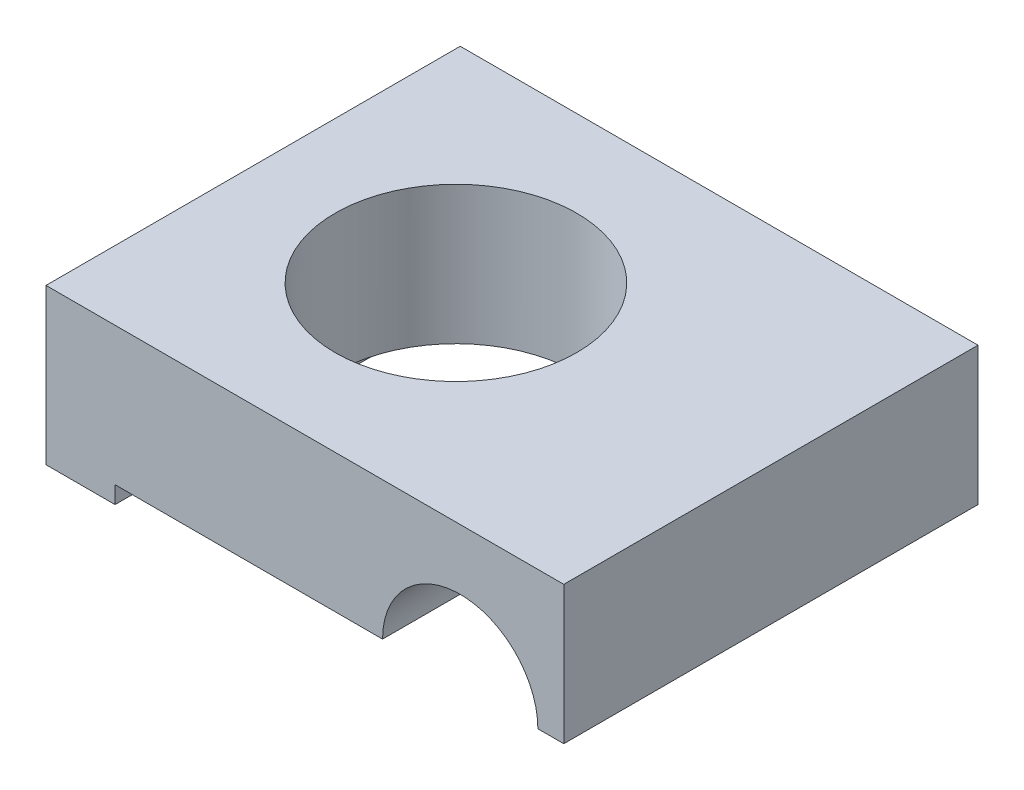
ISO-10303-21;
HEADER;
FILE_DESCRIPTION(('STEP AP214'),'2;1');
FILE_NAME('part.step','',(''),(''),'','','');
FILE_SCHEMA(('AUTOMOTIVE_DESIGN { 1 0 10303 214 1 1 1 1 }'));
ENDSEC;
DATA;
#1=APPLICATION_CONTEXT('core data for automotive mechanical design processes');
#2=APPLICATION_PROTOCOL_DEFINITION('international standard','automotive_design',2000,#1);
#3=PRODUCT_CONTEXT('',#1,'mechanical');
#4=PRODUCT('Part','Part','',(#3));
#5=PRODUCT_RELATED_PRODUCT_CATEGORY('part','',(#4));
#6=PRODUCT_DEFINITION_FORMATION('','',#4);
#7=PRODUCT_DEFINITION_CONTEXT('part definition',#1,'design');
#8=PRODUCT_DEFINITION('design','',#6,#7);
#9=PRODUCT_DEFINITION_SHAPE('','',#8);
#10=(LENGTH_UNIT() NAMED_UNIT(*) SI_UNIT(.MILLI.,.METRE.));
#11=(NAMED_UNIT(*) PLANE_ANGLE_UNIT() SI_UNIT($,.RADIAN.));
#12=(NAMED_UNIT(*) SI_UNIT($,.STERADIAN.) SOLID_ANGLE_UNIT());
#13=UNCERTAINTY_MEASURE_WITH_UNIT(LENGTH_MEASURE(1.E-05),#10,'distance_accuracy_value','');
#14=(GEOMETRIC_REPRESENTATION_CONTEXT(3) GLOBAL_UNCERTAINTY_ASSIGNED_CONTEXT((#13)) GLOBAL_UNIT_ASSIGNED_CONTEXT((#10,
#11,#12)) REPRESENTATION_CONTEXT('',''));
#15=CARTESIAN_POINT('',(0.,0.,0.));
#16=DIRECTION('',(0.,0.,1.));
#17=DIRECTION('',(1.,0.,0.));
#18=AXIS2_PLACEMENT_3D('',#15,#16,#17);
#19=CARTESIAN_POINT('',(0.,0.,6.));
#20=DIRECTION('',(0.,0.,-1.));
#21=DIRECTION('',(-1.,0.,0.));
#22=AXIS2_PLACEMENT_3D('',#19,#20,#21);
#23=CYLINDRICAL_SURFACE('',#22,2.25);
#24=CARTESIAN_POINT('',(0.,0.,-6.));
#25=DIRECTION('',(0.,0.,1.));
#26=DIRECTION('',(1.,0.,0.));
#27=AXIS2_PLACEMENT_3D('',#24,#25,#26);
#28=CIRCLE('',#27,2.25);
#29=CARTESIAN_POINT('',(2.25,0.,-6.));
#30=VERTEX_POINT('',#29);
#31=CARTESIAN_POINT('',(-2.25,0.,-6.));
#32=VERTEX_POINT('',#31);
#33=EDGE_CURVE('E125',#30,#32,#28,.T.);
#34=ORIENTED_EDGE('',*,*,#33,.F.);
#35=DIRECTION('',(0.,0.,-1.));
#36=VECTOR('',#35,1.);
#37=CARTESIAN_POINT('',(2.25,0.,6.));
#38=LINE('',#37,#36);
#39=CARTESIAN_POINT('',(2.25,0.,6.));
#40=VERTEX_POINT('',#39);
#41=EDGE_CURVE('E11',#40,#30,#38,.T.);
#42=ORIENTED_EDGE('',*,*,#41,.F.);
#43=CARTESIAN_POINT('',(0.,0.,6.));
#44=DIRECTION('',(0.,0.,1.));
#45=DIRECTION('',(1.,0.,0.));
#46=AXIS2_PLACEMENT_3D('',#43,#44,#45);
#47=CIRCLE('',#46,2.25);
#48=CARTESIAN_POINT('',(-2.25,0.,6.));
#49=VERTEX_POINT('',#48);
#50=EDGE_CURVE('E146',#40,#49,#47,.T.);
#51=ORIENTED_EDGE('',*,*,#50,.T.);
#52=DIRECTION('',(0.,0.,-1.));
#53=VECTOR('',#52,1.);
#54=CARTESIAN_POINT('',(-2.25,0.,6.));
#55=LINE('',#54,#53);
#56=EDGE_CURVE('E48',#49,#32,#55,.T.);
#57=ORIENTED_EDGE('',*,*,#56,.T.);
#58=EDGE_LOOP('',(#34,#42,#51,#57));
#59=FACE_BOUND('',#58,.T.);
#60=ADVANCED_FACE('F32',(#59),#23,.F.);
#61=CARTESIAN_POINT('',(-4.51084990785713,0.,6.));
#62=DIRECTION('',(0.,-1.,0.));
#63=DIRECTION('',(1.,0.,0.));
#64=AXIS2_PLACEMENT_3D('',#61,#62,#63);
#65=PLANE('',#64);
#66=DIRECTION('',(-1.,0.,0.));
#67=VECTOR('',#66,1.);
#68=CARTESIAN_POINT('',(-4.51084990785713,0.,-6.));
#69=LINE('',#68,#67);
#70=CARTESIAN_POINT('',(3.,0.,-6.));
#71=VERTEX_POINT('',#70);
#72=EDGE_CURVE('E127',#71,#30,#69,.T.);
#73=ORIENTED_EDGE('',*,*,#72,.F.);
#74=DIRECTION('',(0.,0.,-1.));
#75=VECTOR('',#74,1.);
#76=CARTESIAN_POINT('',(3.,0.,6.));
#77=LINE('',#76,#75);
#78=CARTESIAN_POINT('',(3.,0.,6.));
#79=VERTEX_POINT('',#78);
#80=EDGE_CURVE('E40',#79,#71,#77,.T.);
#81=ORIENTED_EDGE('',*,*,#80,.F.);
#82=DIRECTION('',(-1.,0.,0.));
#83=VECTOR('',#82,1.);
#84=CARTESIAN_POINT('',(-4.51084990785713,0.,6.));
#85=LINE('',#84,#83);
#86=EDGE_CURVE('E172',#79,#40,#85,.T.);
#87=ORIENTED_EDGE('',*,*,#86,.T.);
#88=ORIENTED_EDGE('',*,*,#41,.T.);
#89=EDGE_LOOP('',(#73,#81,#87,#88));
#90=FACE_BOUND('',#89,.T.);
#91=ADVANCED_FACE('F163',(#90),#65,.T.);
#92=CARTESIAN_POINT('',(3.,-10.8077815239313,6.));
#93=DIRECTION('',(1.,0.,0.));
#94=DIRECTION('',(0.,1.,0.));
#95=AXIS2_PLACEMENT_3D('',#92,#93,#94);
#96=PLANE('',#95);
#97=DIRECTION('',(0.,-1.,0.));
#98=VECTOR('',#97,1.);
#99=CARTESIAN_POINT('',(3.,-10.8077815239313,-6.));
#100=LINE('',#99,#98);
#101=CARTESIAN_POINT('',(3.,4.,-6.));
#102=VERTEX_POINT('',#101);
#103=EDGE_CURVE('E131',#102,#71,#100,.T.);
#104=ORIENTED_EDGE('',*,*,#103,.F.);
#105=DIRECTION('',(0.,0.,-1.));
#106=VECTOR('',#105,1.);
#107=CARTESIAN_POINT('',(3.,4.,6.));
#108=LINE('',#107,#106);
#109=CARTESIAN_POINT('',(3.,4.,6.));
#110=VERTEX_POINT('',#109);
#111=EDGE_CURVE('E152',#110,#102,#108,.T.);
#112=ORIENTED_EDGE('',*,*,#111,.F.);
#113=DIRECTION('',(0.,-1.,0.));
#114=VECTOR('',#113,1.);
#115=CARTESIAN_POINT('',(3.,-10.8077815239313,6.));
#116=LINE('',#115,#114);
#117=EDGE_CURVE('E159',#110,#79,#116,.T.);
#118=ORIENTED_EDGE('',*,*,#117,.T.);
#119=ORIENTED_EDGE('',*,*,#80,.T.);
#120=EDGE_LOOP('',(#104,#112,#118,#119));
#121=FACE_BOUND('',#120,.T.);
#122=ADVANCED_FACE('F157',(#121),#96,.T.);
#123=CARTESIAN_POINT('',(-4.51084990785713,4.,6.));
#124=DIRECTION('',(0.,1.,0.));
#125=DIRECTION('',(0.,0.,1.));
#126=AXIS2_PLACEMENT_3D('',#123,#124,#125);
#127=PLANE('',#126);
#128=CARTESIAN_POINT('',(-6.125,4.,0.));
#129=DIRECTION('',(0.,1.,0.));
#130=DIRECTION('',(0.,0.,1.));
#131=AXIS2_PLACEMENT_3D('',#128,#129,#130);
#132=CIRCLE('',#131,3.5);
#133=CARTESIAN_POINT('',(-6.125,4.,3.5));
#134=VERTEX_POINT('',#133);
#135=EDGE_CURVE('E128',#134,#134,#132,.T.);
#136=ORIENTED_EDGE('',*,*,#135,.F.);
#137=EDGE_LOOP('',(#136));
#138=FACE_BOUND('',#137,.T.);
#139=DIRECTION('',(1.,0.,0.));
#140=VECTOR('',#139,1.);
#141=CARTESIAN_POINT('',(-4.51084990785713,4.,-6.));
#142=LINE('',#141,#140);
#143=CARTESIAN_POINT('',(-12.,4.,-6.));
#144=VERTEX_POINT('',#143);
#145=EDGE_CURVE('E134',#144,#102,#142,.T.);
#146=ORIENTED_EDGE('',*,*,#145,.F.);
#147=DIRECTION('',(0.,0.,-1.));
#148=VECTOR('',#147,1.);
#149=CARTESIAN_POINT('',(-12.,4.,6.));
#150=LINE('',#149,#148);
#151=CARTESIAN_POINT('',(-12.,4.,6.));
#152=VERTEX_POINT('',#151);
#153=EDGE_CURVE('E150',#152,#144,#150,.T.);
#154=ORIENTED_EDGE('',*,*,#153,.F.);
#155=DIRECTION('',(1.,0.,0.));
#156=VECTOR('',#155,1.);
#157=CARTESIAN_POINT('',(-4.51084990785713,4.,6.));
#158=LINE('',#157,#156);
#159=EDGE_CURVE('E171',#152,#110,#158,.T.);
#160=ORIENTED_EDGE('',*,*,#159,.T.);
#161=ORIENTED_EDGE('',*,*,#111,.T.);
#162=EDGE_LOOP('',(#146,#154,#160,#161));
#163=FACE_BOUND('',#162,.T.);
#164=ADVANCED_FACE('F169',(#138,#163),#127,.T.);
#165=CARTESIAN_POINT('',(-12.,-10.8077815239313,6.));
#166=DIRECTION('',(-1.,0.,0.));
#167=DIRECTION('',(0.,0.,1.));
#168=AXIS2_PLACEMENT_3D('',#165,#166,#167);
#169=PLANE('',#168);
#170=DIRECTION('',(0.,1.,0.));
#171=VECTOR('',#170,1.);
#172=CARTESIAN_POINT('',(-12.,-10.8077815239313,-6.));
#173=LINE('',#172,#171);
#174=CARTESIAN_POINT('',(-12.,-0.5,-6.));
#175=VERTEX_POINT('',#174);
#176=EDGE_CURVE('E137',#175,#144,#173,.T.);
#177=ORIENTED_EDGE('',*,*,#176,.F.);
#178=DIRECTION('',(0.,0.,-1.));
#179=VECTOR('',#178,1.);
#180=CARTESIAN_POINT('',(-12.,-0.5,6.));
#181=LINE('',#180,#179);
#182=CARTESIAN_POINT('',(-12.,-0.5,6.));
#183=VERTEX_POINT('',#182);
#184=EDGE_CURVE('E117',#183,#175,#181,.T.);
#185=ORIENTED_EDGE('',*,*,#184,.F.);
#186=DIRECTION('',(0.,1.,0.));
#187=VECTOR('',#186,1.);
#188=CARTESIAN_POINT('',(-12.,-10.8077815239313,6.));
#189=LINE('',#188,#187);
#190=EDGE_CURVE('E107',#183,#152,#189,.T.);
#191=ORIENTED_EDGE('',*,*,#190,.T.);
#192=ORIENTED_EDGE('',*,*,#153,.T.);
#193=EDGE_LOOP('',(#177,#185,#191,#192));
#194=FACE_BOUND('',#193,.T.);
#195=ADVANCED_FACE('F178',(#194),#169,.T.);
#196=CARTESIAN_POINT('',(-4.51084990785713,-0.500000000000002,6.));
#197=DIRECTION('',(0.,1.,0.));
#198=DIRECTION('',(0.,0.,1.));
#199=AXIS2_PLACEMENT_3D('',#196,#197,#198);
#200=PLANE('',#199);
#201=DIRECTION('',(1.,0.,0.));
#202=VECTOR('',#201,1.);
#203=CARTESIAN_POINT('',(-4.51084990785713,-0.500000000000002,-6.));
#204=LINE('',#203,#202);
#205=CARTESIAN_POINT('',(-10.,-0.500000000000002,-6.));
#206=VERTEX_POINT('',#205);
#207=EDGE_CURVE('E114',#175,#206,#204,.T.);
#208=ORIENTED_EDGE('',*,*,#207,.T.);
#209=DIRECTION('',(0.,0.,-1.));
#210=VECTOR('',#209,1.);
#211=CARTESIAN_POINT('',(-10.,-0.500000000000002,6.));
#212=LINE('',#211,#210);
#213=CARTESIAN_POINT('',(-10.,-0.500000000000002,6.));
#214=VERTEX_POINT('',#213);
#215=EDGE_CURVE('E111',#214,#206,#212,.T.);
#216=ORIENTED_EDGE('',*,*,#215,.F.);
#217=DIRECTION('',(1.,0.,0.));
#218=VECTOR('',#217,1.);
#219=CARTESIAN_POINT('',(-4.51084990785713,-0.500000000000002,6.));
#220=LINE('',#219,#218);
#221=EDGE_CURVE('E99',#183,#214,#220,.T.);
#222=ORIENTED_EDGE('',*,*,#221,.F.);
#223=ORIENTED_EDGE('',*,*,#184,.T.);
#224=EDGE_LOOP('',(#208,#216,#222,#223));
#225=FACE_BOUND('',#224,.T.);
#226=ADVANCED_FACE('F112',(#225),#200,.F.);
#227=CARTESIAN_POINT('',(-10.,-10.8077815239313,6.));
#228=DIRECTION('',(1.,0.,0.));
#229=DIRECTION('',(0.,0.,-1.));
#230=AXIS2_PLACEMENT_3D('',#227,#228,#229);
#231=PLANE('',#230);
#232=DIRECTION('',(0.,-1.,0.));
#233=VECTOR('',#232,1.);
#234=CARTESIAN_POINT('',(-10.,-10.8077815239313,-6.));
#235=LINE('',#234,#233);
#236=CARTESIAN_POINT('',(-10.,0.,-6.));
#237=VERTEX_POINT('',#236);
#238=EDGE_CURVE('E141',#237,#206,#235,.T.);
#239=ORIENTED_EDGE('',*,*,#238,.F.);
#240=DIRECTION('',(0.,0.,-1.));
#241=VECTOR('',#240,1.);
#242=CARTESIAN_POINT('',(-10.,0.,6.));
#243=LINE('',#242,#241);
#244=CARTESIAN_POINT('',(-10.,0.,6.));
#245=VERTEX_POINT('',#244);
#246=EDGE_CURVE('E73',#245,#237,#243,.T.);
#247=ORIENTED_EDGE('',*,*,#246,.F.);
#248=DIRECTION('',(0.,-1.,0.));
#249=VECTOR('',#248,1.);
#250=CARTESIAN_POINT('',(-10.,-10.8077815239313,6.));
#251=LINE('',#250,#249);
#252=EDGE_CURVE('E104',#245,#214,#251,.T.);
#253=ORIENTED_EDGE('',*,*,#252,.T.);
#254=ORIENTED_EDGE('',*,*,#215,.T.);
#255=EDGE_LOOP('',(#239,#247,#253,#254));
#256=FACE_BOUND('',#255,.T.);
#257=ADVANCED_FACE('F119',(#256),#231,.T.);
#258=CARTESIAN_POINT('',(-4.51084990785713,0.,6.));
#259=DIRECTION('',(0.,-1.,0.));
#260=DIRECTION('',(1.,0.,0.));
#261=AXIS2_PLACEMENT_3D('',#258,#259,#260);
#262=PLANE('',#261);
#263=CARTESIAN_POINT('',(-6.125,0.,0.));
#264=DIRECTION('',(0.,-1.,0.));
#265=DIRECTION('',(1.,0.,0.));
#266=AXIS2_PLACEMENT_3D('',#263,#264,#265);
#267=CIRCLE('',#266,3.5);
#268=CARTESIAN_POINT('',(-2.625,0.,0.));
#269=VERTEX_POINT('',#268);
#270=EDGE_CURVE('E260',#269,#269,#267,.T.);
#271=ORIENTED_EDGE('',*,*,#270,.F.);
#272=EDGE_LOOP('',(#271));
#273=FACE_BOUND('',#272,.T.);
#274=DIRECTION('',(-1.,0.,0.));
#275=VECTOR('',#274,1.);
#276=CARTESIAN_POINT('',(-4.51084990785713,0.,-6.));
#277=LINE('',#276,#275);
#278=EDGE_CURVE('E143',#32,#237,#277,.T.);
#279=ORIENTED_EDGE('',*,*,#278,.F.);
#280=ORIENTED_EDGE('',*,*,#56,.F.);
#281=DIRECTION('',(-1.,0.,0.));
#282=VECTOR('',#281,1.);
#283=CARTESIAN_POINT('',(-4.51084990785713,0.,6.));
#284=LINE('',#283,#282);
#285=EDGE_CURVE('E120',#49,#245,#284,.T.);
#286=ORIENTED_EDGE('',*,*,#285,.T.);
#287=ORIENTED_EDGE('',*,*,#246,.T.);
#288=EDGE_LOOP('',(#279,#280,#286,#287));
#289=FACE_BOUND('',#288,.T.);
#290=ADVANCED_FACE('F179',(#273,#289),#262,.T.);
#291=CARTESIAN_POINT('',(-4.51084990785713,-10.8077815239313,6.));
#292=DIRECTION('',(0.,0.,1.));
#293=DIRECTION('',(1.,0.,0.));
#294=AXIS2_PLACEMENT_3D('',#291,#292,#293);
#295=PLANE('',#294);
#296=ORIENTED_EDGE('',*,*,#50,.F.);
#297=ORIENTED_EDGE('',*,*,#86,.F.);
#298=ORIENTED_EDGE('',*,*,#117,.F.);
#299=ORIENTED_EDGE('',*,*,#159,.F.);
#300=ORIENTED_EDGE('',*,*,#190,.F.);
#301=ORIENTED_EDGE('',*,*,#221,.T.);
#302=ORIENTED_EDGE('',*,*,#252,.F.);
#303=ORIENTED_EDGE('',*,*,#285,.F.);
#304=EDGE_LOOP('',(#296,#297,#298,#299,#300,#301,#302,#303));
#305=FACE_BOUND('',#304,.T.);
#306=ADVANCED_FACE('F101',(#305),#295,.T.);
#307=CARTESIAN_POINT('',(-4.51084990785713,-10.8077815239313,-6.));
#308=DIRECTION('',(0.,0.,1.));
#309=DIRECTION('',(1.,0.,0.));
#310=AXIS2_PLACEMENT_3D('',#307,#308,#309);
#311=PLANE('',#310);
#312=ORIENTED_EDGE('',*,*,#33,.T.);
#313=ORIENTED_EDGE('',*,*,#278,.T.);
#314=ORIENTED_EDGE('',*,*,#238,.T.);
#315=ORIENTED_EDGE('',*,*,#207,.F.);
#316=ORIENTED_EDGE('',*,*,#176,.T.);
#317=ORIENTED_EDGE('',*,*,#145,.T.);
#318=ORIENTED_EDGE('',*,*,#103,.T.);
#319=ORIENTED_EDGE('',*,*,#72,.T.);
#320=EDGE_LOOP('',(#312,#313,#314,#315,#316,#317,#318,#319));
#321=FACE_BOUND('',#320,.T.);
#322=ADVANCED_FACE('F165',(#321),#311,.F.);
#323=CARTESIAN_POINT('',(-6.125,12.,0.));
#324=DIRECTION('',(0.,-1.,0.));
#325=DIRECTION('',(1.,0.,0.));
#326=AXIS2_PLACEMENT_3D('',#323,#324,#325);
#327=CYLINDRICAL_SURFACE('',#326,3.5);
#328=ORIENTED_EDGE('',*,*,#135,.T.);
#329=EDGE_LOOP('',(#328));
#330=FACE_BOUND('',#329,.T.);
#331=ORIENTED_EDGE('',*,*,#270,.T.);
#332=EDGE_LOOP('',(#331));
#333=FACE_BOUND('',#332,.T.);
#334=ADVANCED_FACE('F232',(#330,#333),#327,.F.);
#335=CLOSED_SHELL('',(#60,#91,#122,#164,#195,#226,#257,#290,#306,#322,#334));
#336=MANIFOLD_SOLID_BREP('B2',#335);
#337=ADVANCED_BREP_SHAPE_REPRESENTATION('',(#18,#336),#14);
#338=SHAPE_DEFINITION_REPRESENTATION(#9,#337);
ENDSEC;
END-ISO-10303-21;
